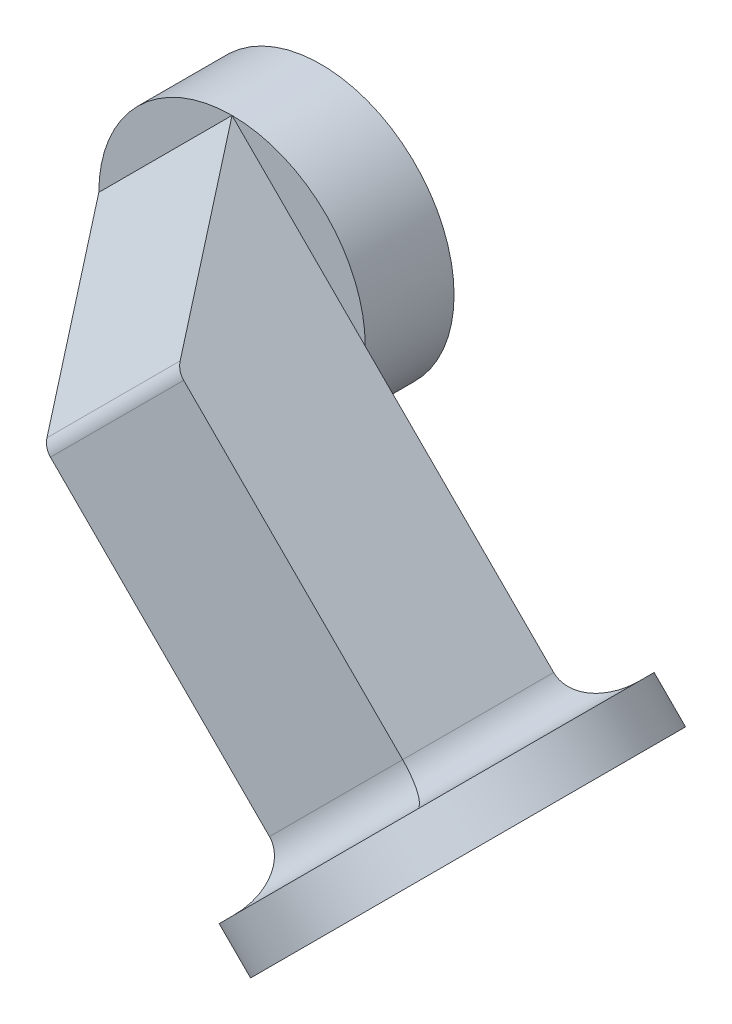
ISO-10303-21;
HEADER;
FILE_DESCRIPTION(('STEP AP214'),'2;1');
FILE_NAME('part.step','',(''),(''),'','','');
FILE_SCHEMA(('AUTOMOTIVE_DESIGN { 1 0 10303 214 1 1 1 1 }'));
ENDSEC;
DATA;
#1=APPLICATION_CONTEXT('core data for automotive mechanical design processes');
#2=APPLICATION_PROTOCOL_DEFINITION('international standard','automotive_design',2000,#1);
#3=PRODUCT_CONTEXT('',#1,'mechanical');
#4=PRODUCT('Part','Part','',(#3));
#5=PRODUCT_RELATED_PRODUCT_CATEGORY('part','',(#4));
#6=PRODUCT_DEFINITION_FORMATION('','',#4);
#7=PRODUCT_DEFINITION_CONTEXT('part definition',#1,'design');
#8=PRODUCT_DEFINITION('design','',#6,#7);
#9=PRODUCT_DEFINITION_SHAPE('','',#8);
#10=(LENGTH_UNIT() NAMED_UNIT(*) SI_UNIT(.MILLI.,.METRE.));
#11=(NAMED_UNIT(*) PLANE_ANGLE_UNIT() SI_UNIT($,.RADIAN.));
#12=(NAMED_UNIT(*) SI_UNIT($,.STERADIAN.) SOLID_ANGLE_UNIT());
#13=UNCERTAINTY_MEASURE_WITH_UNIT(LENGTH_MEASURE(1.E-05),#10,'distance_accuracy_value','');
#14=(GEOMETRIC_REPRESENTATION_CONTEXT(3) GLOBAL_UNCERTAINTY_ASSIGNED_CONTEXT((#13)) GLOBAL_UNIT_ASSIGNED_CONTEXT((#10,
#11,#12)) REPRESENTATION_CONTEXT('',''));
#15=CARTESIAN_POINT('',(0.,0.,0.));
#16=DIRECTION('',(0.,0.,1.));
#17=DIRECTION('',(1.,0.,0.));
#18=AXIS2_PLACEMENT_3D('',#15,#16,#17);
#19=CARTESIAN_POINT('',(23.3486659147798,-49.5828708116351,34.29));
#20=DIRECTION('',(0.,0.,-1.));
#21=DIRECTION('',(-1.,0.,0.));
#22=AXIS2_PLACEMENT_3D('',#19,#20,#21);
#23=CYLINDRICAL_SURFACE('',#22,5.08);
#24=CARTESIAN_POINT('',(23.3486659147798,-49.5828708116351,39.37));
#25=DIRECTION('',(0.5,0.5,0.707106781186547));
#26=DIRECTION('',(0.5,0.5,-0.707106781186547));
#27=AXIS2_PLACEMENT_3D('',#24,#25,#26);
#28=ELLIPSE('',#27,7.18420489685532,5.08);
#29=CARTESIAN_POINT('',(26.9407683632075,-45.9907683632075,34.29));
#30=VERTEX_POINT('',#29);
#31=CARTESIAN_POINT('',(26.9407683632075,-53.1749732600628,39.37));
#32=VERTEX_POINT('',#31);
#33=EDGE_CURVE('E11',#30,#32,#28,.F.);
#34=ORIENTED_EDGE('',*,*,#33,.F.);
#35=DIRECTION('',(0.,0.,1.));
#36=VECTOR('',#35,1.);
#37=CARTESIAN_POINT('',(26.9407683632075,-45.9907683632075,34.29));
#38=LINE('',#37,#36);
#39=CARTESIAN_POINT('',(26.9407683632075,-45.9907683632075,12.7));
#40=VERTEX_POINT('',#39);
#41=EDGE_CURVE('E180',#40,#30,#38,.T.);
#42=ORIENTED_EDGE('',*,*,#41,.F.);
#43=CARTESIAN_POINT('',(23.3486659147798,-49.5828708116351,7.62));
#44=DIRECTION('',(0.5,0.5,-0.707106781186547));
#45=DIRECTION('',(-0.5,-0.5,-0.707106781186547));
#46=AXIS2_PLACEMENT_3D('',#43,#44,#45);
#47=ELLIPSE('',#46,7.18420489685532,5.08);
#48=CARTESIAN_POINT('',(26.9407683632075,-53.1749732600628,7.62));
#49=VERTEX_POINT('',#48);
#50=EDGE_CURVE('E40',#40,#49,#47,.T.);
#51=ORIENTED_EDGE('',*,*,#50,.T.);
#52=DIRECTION('',(0.,0.,1.));
#53=VECTOR('',#52,1.);
#54=CARTESIAN_POINT('',(26.9407683632075,-53.1749732600628,34.29));
#55=LINE('',#54,#53);
#56=EDGE_CURVE('E163',#32,#49,#55,.F.);
#57=ORIENTED_EDGE('',*,*,#56,.F.);
#58=EDGE_LOOP('',(#34,#42,#51,#57));
#59=FACE_BOUND('',#58,.T.);
#60=ADVANCED_FACE('F33',(#59),#23,.F.);
#61=CARTESIAN_POINT('',(26.9407683632075,-45.9907683632075,7.62));
#62=DIRECTION('',(0.707106781186547,0.707106781186548,0.));
#63=DIRECTION('',(-0.707106781186548,0.707106781186547,0.));
#64=AXIS2_PLACEMENT_3D('',#61,#62,#63);
#65=CYLINDRICAL_SURFACE('',#64,5.08);
#66=ORIENTED_EDGE('',*,*,#50,.F.);
#67=DIRECTION('',(-0.707106781186547,-0.707106781186548,0.));
#68=VECTOR('',#67,1.);
#69=CARTESIAN_POINT('',(26.9407683632075,-45.9907683632075,12.7));
#70=LINE('',#69,#68);
#71=CARTESIAN_POINT('',(45.9907683632075,-26.9407683632075,12.7));
#72=VERTEX_POINT('',#71);
#73=EDGE_CURVE('E177',#72,#40,#70,.T.);
#74=ORIENTED_EDGE('',*,*,#73,.F.);
#75=CARTESIAN_POINT('',(49.5828708116351,-23.3486659147798,7.62));
#76=DIRECTION('',(0.5,0.5,0.707106781186547));
#77=DIRECTION('',(0.5,0.5,-0.707106781186547));
#78=AXIS2_PLACEMENT_3D('',#75,#76,#77);
#79=ELLIPSE('',#78,7.18420489685532,5.08);
#80=CARTESIAN_POINT('',(53.1749732600628,-26.9407683632075,7.62));
#81=VERTEX_POINT('',#80);
#82=EDGE_CURVE('E54',#72,#81,#79,.T.);
#83=ORIENTED_EDGE('',*,*,#82,.T.);
#84=DIRECTION('',(-0.707106781186547,-0.707106781186548,0.));
#85=VECTOR('',#84,1.);
#86=CARTESIAN_POINT('',(30.5328708116351,-49.5828708116351,7.62));
#87=LINE('',#86,#85);
#88=EDGE_CURVE('E166',#49,#81,#87,.F.);
#89=ORIENTED_EDGE('',*,*,#88,.F.);
#90=EDGE_LOOP('',(#66,#74,#83,#89));
#91=FACE_BOUND('',#90,.T.);
#92=ADVANCED_FACE('F187',(#91),#65,.F.);
#93=CARTESIAN_POINT('',(49.5828708116351,-23.3486659147798,34.29));
#94=DIRECTION('',(0.,0.,1.));
#95=DIRECTION('',(1.,0.,0.));
#96=AXIS2_PLACEMENT_3D('',#93,#94,#95);
#97=CYLINDRICAL_SURFACE('',#96,5.08);
#98=ORIENTED_EDGE('',*,*,#82,.F.);
#99=DIRECTION('',(0.,0.,-1.));
#100=VECTOR('',#99,1.);
#101=CARTESIAN_POINT('',(45.9907683632075,-26.9407683632075,34.29));
#102=LINE('',#101,#100);
#103=CARTESIAN_POINT('',(45.9907683632075,-26.9407683632075,34.29));
#104=VERTEX_POINT('',#103);
#105=EDGE_CURVE('E175',#104,#72,#102,.T.);
#106=ORIENTED_EDGE('',*,*,#105,.F.);
#107=CARTESIAN_POINT('',(49.5828708116351,-23.3486659147798,39.37));
#108=DIRECTION('',(-0.5,-0.5,0.707106781186547));
#109=DIRECTION('',(0.5,0.5,0.707106781186547));
#110=AXIS2_PLACEMENT_3D('',#107,#108,#109);
#111=ELLIPSE('',#110,7.18420489685532,5.08);
#112=CARTESIAN_POINT('',(53.1749732600628,-26.9407683632075,39.37));
#113=VERTEX_POINT('',#112);
#114=EDGE_CURVE('E183',#104,#113,#111,.T.);
#115=ORIENTED_EDGE('',*,*,#114,.T.);
#116=DIRECTION('',(0.,0.,-1.));
#117=VECTOR('',#116,1.);
#118=CARTESIAN_POINT('',(53.1749732600628,-26.9407683632075,34.29));
#119=LINE('',#118,#117);
#120=EDGE_CURVE('E169',#81,#113,#119,.F.);
#121=ORIENTED_EDGE('',*,*,#120,.F.);
#122=EDGE_LOOP('',(#98,#106,#115,#121));
#123=FACE_BOUND('',#122,.T.);
#124=ADVANCED_FACE('F249',(#123),#97,.F.);
#125=CARTESIAN_POINT('',(36.4657683632075,-36.4657683632075,39.37));
#126=DIRECTION('',(0.707106781186547,0.707106781186548,0.));
#127=DIRECTION('',(-0.707106781186548,0.707106781186547,0.));
#128=AXIS2_PLACEMENT_3D('',#125,#126,#127);
#129=CYLINDRICAL_SURFACE('',#128,5.08);
#130=DIRECTION('',(0.707106781186547,0.707106781186548,0.));
#131=VECTOR('',#130,1.);
#132=CARTESIAN_POINT('',(36.4657683632075,-36.4657683632075,34.29));
#133=LINE('',#132,#131);
#134=EDGE_CURVE('E160',#30,#104,#133,.T.);
#135=ORIENTED_EDGE('',*,*,#134,.F.);
#136=ORIENTED_EDGE('',*,*,#33,.T.);
#137=DIRECTION('',(0.707106781186547,0.707106781186548,0.));
#138=VECTOR('',#137,1.);
#139=CARTESIAN_POINT('',(40.0578708116351,-40.0578708116351,39.37));
#140=LINE('',#139,#138);
#141=EDGE_CURVE('E172',#113,#32,#140,.F.);
#142=ORIENTED_EDGE('',*,*,#141,.F.);
#143=ORIENTED_EDGE('',*,*,#114,.F.);
#144=EDGE_LOOP('',(#135,#136,#142,#143));
#145=FACE_BOUND('',#144,.T.);
#146=ADVANCED_FACE('F194',(#145),#129,.F.);
#147=CARTESIAN_POINT('',(-15.8604703137682,-26.155271309502,31.75));
#148=DIRECTION('',(-0.707106781186547,-0.707106781186548,0.));
#149=DIRECTION('',(0.707106781186548,-0.707106781186547,0.));
#150=AXIS2_PLACEMENT_3D('',#147,#148,#149);
#151=CYLINDRICAL_SURFACE('',#150,2.54);
#152=DIRECTION('',(0.707106781186547,0.707106781186548,0.));
#153=VECTOR('',#152,1.);
#154=CARTESIAN_POINT('',(-17.1894719589103,-24.82626966436,33.4585400944723));
#155=LINE('',#154,#153);
#156=CARTESIAN_POINT('',(-5.70660114727514,-13.3433988527249,33.4585400944723));
#157=VERTEX_POINT('',#156);
#158=CARTESIAN_POINT('',(13.3433988527249,5.70660114727514,33.4585400944723));
#159=VERTEX_POINT('',#158);
#160=EDGE_CURVE('E104',#157,#159,#155,.T.);
#161=ORIENTED_EDGE('',*,*,#160,.F.);
#162=CARTESIAN_POINT('',(-4.37759950213307,-14.6724004978669,31.75));
#163=DIRECTION('',(0.707106781186548,0.707106781186548,0.));
#164=DIRECTION('',(-0.707106781186548,0.707106781186548,0.));
#165=AXIS2_PLACEMENT_3D('',#162,#163,#164);
#166=CIRCLE('',#165,2.54);
#167=CARTESIAN_POINT('',(-4.37759950213307,-14.6724004978669,34.29));
#168=VERTEX_POINT('',#167);
#169=EDGE_CURVE('E156',#168,#157,#166,.F.);
#170=ORIENTED_EDGE('',*,*,#169,.F.);
#171=DIRECTION('',(0.707106781186547,0.707106781186548,0.));
#172=VECTOR('',#171,1.);
#173=CARTESIAN_POINT('',(-15.8604703137682,-26.155271309502,34.29));
#174=LINE('',#173,#172);
#175=CARTESIAN_POINT('',(14.6724004978669,4.37759950213308,34.29));
#176=VERTEX_POINT('',#175);
#177=EDGE_CURVE('E153',#176,#168,#174,.F.);
#178=ORIENTED_EDGE('',*,*,#177,.F.);
#179=CARTESIAN_POINT('',(14.6724004978669,4.37759950213308,31.75));
#180=DIRECTION('',(-0.707106781186547,-0.707106781186548,0.));
#181=DIRECTION('',(0.707106781186548,-0.707106781186547,0.));
#182=AXIS2_PLACEMENT_3D('',#179,#180,#181);
#183=CIRCLE('',#182,2.54);
#184=EDGE_CURVE('E158',#159,#176,#183,.F.);
#185=ORIENTED_EDGE('',*,*,#184,.F.);
#186=EDGE_LOOP('',(#161,#170,#178,#185));
#187=FACE_BOUND('',#186,.T.);
#188=ADVANCED_FACE('F208',(#187),#151,.T.);
#189=CARTESIAN_POINT('',(0.,0.,12.7));
#190=DIRECTION('',(0.,0.,1.));
#191=DIRECTION('',(1.,0.,0.));
#192=AXIS2_PLACEMENT_3D('',#189,#190,#191);
#193=PLANE('',#192);
#194=DIRECTION('',(-0.707106781186547,-0.707106781186547,0.));
#195=VECTOR('',#194,1.);
#196=CARTESIAN_POINT('',(0.,19.05,12.7));
#197=LINE('',#196,#195);
#198=CARTESIAN_POINT('',(0.,19.05,12.7));
#199=VERTEX_POINT('',#198);
#200=CARTESIAN_POINT('',(-19.05,0.,12.7));
#201=VERTEX_POINT('',#200);
#202=EDGE_CURVE('E101',#199,#201,#197,.T.);
#203=ORIENTED_EDGE('',*,*,#202,.F.);
#204=CARTESIAN_POINT('',(0.,0.,12.7));
#205=DIRECTION('',(0.,0.,1.));
#206=DIRECTION('',(1.,0.,0.));
#207=AXIS2_PLACEMENT_3D('',#204,#205,#206);
#208=CIRCLE('',#207,19.05);
#209=EDGE_CURVE('E115',#199,#201,#208,.T.);
#210=ORIENTED_EDGE('',*,*,#209,.T.);
#211=EDGE_LOOP('',(#203,#210));
#212=FACE_BOUND('',#211,.T.);
#213=ADVANCED_FACE('F114',(#212),#193,.T.);
#214=DIRECTION('',(-0.707106781186548,0.707106781186548,0.));
#215=VECTOR('',#214,1.);
#216=CARTESIAN_POINT('',(19.05,0.,12.7));
#217=LINE('',#216,#215);
#218=CARTESIAN_POINT('',(19.05,0.,12.7));
#219=VERTEX_POINT('',#218);
#220=EDGE_CURVE('E133',#219,#199,#217,.T.);
#221=ORIENTED_EDGE('',*,*,#220,.F.);
#222=EDGE_CURVE('E126',#219,#199,#208,.T.);
#223=ORIENTED_EDGE('',*,*,#222,.T.);
#224=EDGE_LOOP('',(#221,#223));
#225=FACE_BOUND('',#224,.T.);
#226=ADVANCED_FACE('F132',(#225),#193,.T.);
#227=CARTESIAN_POINT('',(0.,0.,12.7));
#228=DIRECTION('',(0.,0.,-1.));
#229=DIRECTION('',(-1.,0.,0.));
#230=AXIS2_PLACEMENT_3D('',#227,#228,#229);
#231=CYLINDRICAL_SURFACE('',#230,19.05);
#232=ORIENTED_EDGE('',*,*,#222,.F.);
#233=CARTESIAN_POINT('',(0.,-19.05,12.7));
#234=VERTEX_POINT('',#233);
#235=EDGE_CURVE('E134',#234,#219,#208,.T.);
#236=ORIENTED_EDGE('',*,*,#235,.F.);
#237=EDGE_CURVE('E128',#201,#234,#208,.T.);
#238=ORIENTED_EDGE('',*,*,#237,.F.);
#239=ORIENTED_EDGE('',*,*,#209,.F.);
#240=EDGE_LOOP('',(#232,#236,#238,#239));
#241=FACE_BOUND('',#240,.T.);
#242=CARTESIAN_POINT('',(0.,0.,0.));
#243=DIRECTION('',(0.,0.,1.));
#244=DIRECTION('',(1.,0.,0.));
#245=AXIS2_PLACEMENT_3D('',#242,#243,#244);
#246=CIRCLE('',#245,19.05);
#247=CARTESIAN_POINT('',(19.05,0.,0.));
#248=VERTEX_POINT('',#247);
#249=EDGE_CURVE('E149',#248,#248,#246,.T.);
#250=ORIENTED_EDGE('',*,*,#249,.T.);
#251=EDGE_LOOP('',(#250));
#252=FACE_BOUND('',#251,.T.);
#253=ADVANCED_FACE('F123',(#241,#252),#231,.T.);
#254=DIRECTION('',(0.707106781186548,-0.707106781186548,0.));
#255=VECTOR('',#254,1.);
#256=CARTESIAN_POINT('',(-19.05,0.,12.7));
#257=LINE('',#256,#255);
#258=EDGE_CURVE('E116',#201,#234,#257,.T.);
#259=ORIENTED_EDGE('',*,*,#258,.F.);
#260=ORIENTED_EDGE('',*,*,#237,.T.);
#261=EDGE_LOOP('',(#259,#260));
#262=FACE_BOUND('',#261,.T.);
#263=ADVANCED_FACE('F233',(#262),#193,.T.);
#264=CARTESIAN_POINT('',(0.,0.,0.));
#265=DIRECTION('',(0.,0.,1.));
#266=DIRECTION('',(1.,0.,0.));
#267=AXIS2_PLACEMENT_3D('',#264,#265,#266);
#268=PLANE('',#267);
#269=CARTESIAN_POINT('',(0.,0.,0.));
#270=DIRECTION('',(0.,0.,-1.));
#271=DIRECTION('',(-1.,0.,0.));
#272=AXIS2_PLACEMENT_3D('',#269,#270,#271);
#273=CIRCLE('',#272,4.064);
#274=CARTESIAN_POINT('',(-4.064,0.,0.));
#275=VERTEX_POINT('',#274);
#276=EDGE_CURVE('E216',#275,#275,#273,.T.);
#277=ORIENTED_EDGE('',*,*,#276,.F.);
#278=EDGE_LOOP('',(#277));
#279=FACE_BOUND('',#278,.T.);
#280=ORIENTED_EDGE('',*,*,#249,.F.);
#281=EDGE_LOOP('',(#280));
#282=FACE_BOUND('',#281,.T.);
#283=ADVANCED_FACE('F230',(#279,#282),#268,.F.);
#284=CARTESIAN_POINT('',(-19.05,0.,34.29));
#285=DIRECTION('',(0.707106781186548,0.707106781186548,0.));
#286=DIRECTION('',(-0.707106781186548,0.707106781186548,0.));
#287=AXIS2_PLACEMENT_3D('',#284,#285,#286);
#288=PLANE('',#287);
#289=DIRECTION('',(-0.707106781186548,0.707106781186547,0.));
#290=VECTOR('',#289,1.);
#291=CARTESIAN_POINT('',(30.5328708116351,-49.5828708116351,12.7));
#292=LINE('',#291,#290);
#293=EDGE_CURVE('E117',#40,#234,#292,.T.);
#294=ORIENTED_EDGE('',*,*,#293,.F.);
#295=ORIENTED_EDGE('',*,*,#41,.T.);
#296=DIRECTION('',(0.707106781186548,-0.707106781186548,0.));
#297=VECTOR('',#296,1.);
#298=CARTESIAN_POINT('',(-19.05,0.,34.29));
#299=LINE('',#298,#297);
#300=EDGE_CURVE('E141',#168,#30,#299,.T.);
#301=ORIENTED_EDGE('',*,*,#300,.F.);
#302=ORIENTED_EDGE('',*,*,#169,.T.);
#303=DIRECTION('',(-0.475637908161596,0.475637908161596,-0.739957539754358));
#304=VECTOR('',#303,1.);
#305=CARTESIAN_POINT('',(-11.4513594216806,-7.59864057831937,24.521327298203));
#306=LINE('',#305,#304);
#307=EDGE_CURVE('E108',#157,#201,#306,.T.);
#308=ORIENTED_EDGE('',*,*,#307,.T.);
#309=ORIENTED_EDGE('',*,*,#258,.T.);
#310=EDGE_LOOP('',(#294,#295,#301,#302,#308,#309));
#311=FACE_BOUND('',#310,.T.);
#312=ADVANCED_FACE('F198',(#311),#288,.F.);
#313=CARTESIAN_POINT('',(19.05,0.,34.29));
#314=DIRECTION('',(-0.707106781186547,-0.707106781186548,0.));
#315=DIRECTION('',(0.707106781186548,-0.707106781186547,0.));
#316=AXIS2_PLACEMENT_3D('',#313,#314,#315);
#317=PLANE('',#316);
#318=DIRECTION('',(-0.707106781186548,0.707106781186548,0.));
#319=VECTOR('',#318,1.);
#320=CARTESIAN_POINT('',(19.05,0.,34.29));
#321=LINE('',#320,#319);
#322=EDGE_CURVE('E144',#104,#176,#321,.T.);
#323=ORIENTED_EDGE('',*,*,#322,.F.);
#324=ORIENTED_EDGE('',*,*,#105,.T.);
#325=DIRECTION('',(-0.707106781186548,0.707106781186547,0.));
#326=VECTOR('',#325,1.);
#327=CARTESIAN_POINT('',(49.5828708116351,-30.5328708116351,12.7));
#328=LINE('',#327,#326);
#329=EDGE_CURVE('E139',#72,#219,#328,.T.);
#330=ORIENTED_EDGE('',*,*,#329,.T.);
#331=ORIENTED_EDGE('',*,*,#220,.T.);
#332=DIRECTION('',(-0.475637908161596,0.475637908161596,-0.739957539754358));
#333=VECTOR('',#332,1.);
#334=CARTESIAN_POINT('',(13.8778536409236,5.17214635907645,34.29));
#335=LINE('',#334,#333);
#336=EDGE_CURVE('E97',#159,#199,#335,.T.);
#337=ORIENTED_EDGE('',*,*,#336,.F.);
#338=ORIENTED_EDGE('',*,*,#184,.T.);
#339=EDGE_LOOP('',(#323,#324,#330,#331,#337,#338));
#340=FACE_BOUND('',#339,.T.);
#341=ADVANCED_FACE('F136',(#340),#317,.F.);
#342=CARTESIAN_POINT('',(0.,0.,34.29));
#343=DIRECTION('',(0.,0.,1.));
#344=DIRECTION('',(1.,0.,0.));
#345=AXIS2_PLACEMENT_3D('',#342,#343,#344);
#346=PLANE('',#345);
#347=ORIENTED_EDGE('',*,*,#300,.T.);
#348=ORIENTED_EDGE('',*,*,#134,.T.);
#349=ORIENTED_EDGE('',*,*,#322,.T.);
#350=ORIENTED_EDGE('',*,*,#177,.T.);
#351=EDGE_LOOP('',(#347,#348,#349,#350));
#352=FACE_BOUND('',#351,.T.);
#353=ADVANCED_FACE('F205',(#352),#346,.T.);
#354=CARTESIAN_POINT('',(30.5328708116351,-49.5828708116351,12.7));
#355=DIRECTION('',(0.,0.,1.));
#356=DIRECTION('',(1.,0.,0.));
#357=AXIS2_PLACEMENT_3D('',#354,#355,#356);
#358=PLANE('',#357);
#359=ORIENTED_EDGE('',*,*,#329,.F.);
#360=ORIENTED_EDGE('',*,*,#73,.T.);
#361=ORIENTED_EDGE('',*,*,#293,.T.);
#362=ORIENTED_EDGE('',*,*,#235,.T.);
#363=EDGE_LOOP('',(#359,#360,#361,#362));
#364=FACE_BOUND('',#363,.T.);
#365=ADVANCED_FACE('F269',(#364),#358,.F.);
#366=CARTESIAN_POINT('',(-16.6550171707116,-25.3607244525587,34.29));
#367=DIRECTION('',(0.523228994150421,-0.523228994150421,-0.672653580500898));
#368=DIRECTION('',(-0.78932151559364,0.,-0.61398008519899));
#369=AXIS2_PLACEMENT_3D('',#366,#367,#368);
#370=PLANE('',#369);
#371=ORIENTED_EDGE('',*,*,#307,.F.);
#372=ORIENTED_EDGE('',*,*,#160,.T.);
#373=ORIENTED_EDGE('',*,*,#336,.T.);
#374=ORIENTED_EDGE('',*,*,#202,.T.);
#375=EDGE_LOOP('',(#371,#372,#373,#374));
#376=FACE_BOUND('',#375,.T.);
#377=ADVANCED_FACE('F100',(#376),#370,.F.);
#378=CARTESIAN_POINT('',(44.5479988721697,-44.5479988721697,23.495));
#379=DIRECTION('',(-0.707106781186548,0.707106781186547,0.));
#380=DIRECTION('',(-0.707106781186547,-0.707106781186548,0.));
#381=AXIS2_PLACEMENT_3D('',#378,#379,#380);
#382=CYLINDRICAL_SURFACE('',#381,25.4);
#383=CARTESIAN_POINT('',(44.5479988721697,-44.5479988721697,23.495));
#384=DIRECTION('',(0.707106781186548,-0.707106781186547,0.));
#385=DIRECTION('',(0.707106781186547,0.707106781186548,0.));
#386=AXIS2_PLACEMENT_3D('',#383,#384,#385);
#387=CIRCLE('',#386,25.4);
#388=CARTESIAN_POINT('',(26.5874866300314,-62.508511114308,23.495));
#389=VERTEX_POINT('',#388);
#390=EDGE_CURVE('E109',#389,#389,#387,.T.);
#391=CARTESIAN_POINT('',(40.0578708116351,-40.0578708116351,23.495));
#392=DIRECTION('',(0.707106781186548,-0.707106781186547,0.));
#393=DIRECTION('',(0.707106781186547,0.707106781186548,0.));
#394=AXIS2_PLACEMENT_3D('',#391,#392,#393);
#395=CIRCLE('',#394,25.4);
#396=CARTESIAN_POINT('',(22.0973585694968,-58.0183830537734,23.495));
#397=VERTEX_POINT('',#396);
#398=EDGE_CURVE('E210',#397,#397,#395,.T.);
#399=CARTESIAN_POINT('',(26.5874866300314,-62.508511114308,23.495));
#400=CARTESIAN_POINT('',(26.5407144627342,-62.4617389470108,23.495));
#401=CARTESIAN_POINT('',(26.4939422954369,-62.4149667797135,23.495));
#402=CARTESIAN_POINT('',(26.4003979608425,-62.3214224451191,23.495));
#403=CARTESIAN_POINT('',(26.3536257935452,-62.2746502778218,23.495));
#404=CARTESIAN_POINT('',(26.2600814589508,-62.1811059432274,23.495));
#405=CARTESIAN_POINT('',(26.2133092916535,-62.1343337759301,23.495));
#406=CARTESIAN_POINT('',(26.1197649570591,-62.0407894413357,23.495));
#407=CARTESIAN_POINT('',(26.0729927897618,-61.9940172740384,23.495));
#408=CARTESIAN_POINT('',(25.9794484551674,-61.9004729394439,23.495));
#409=CARTESIAN_POINT('',(25.9326762878701,-61.8537007721467,23.495));
#410=CARTESIAN_POINT('',(25.8391319532756,-61.7601564375522,23.495));
#411=CARTESIAN_POINT('',(25.7923597859784,-61.713384270255,23.495));
#412=CARTESIAN_POINT('',(25.6988154513839,-61.6198399356605,23.495));
#413=CARTESIAN_POINT('',(25.6520432840867,-61.5730677683633,23.495));
#414=CARTESIAN_POINT('',(25.5584989494922,-61.4795234337688,23.495));
#415=CARTESIAN_POINT('',(25.511726782195,-61.4327512664716,23.495));
#416=CARTESIAN_POINT('',(25.4181824476005,-61.3392069318771,23.495));
#417=CARTESIAN_POINT('',(25.3714102803033,-61.2924347645799,23.495));
#418=CARTESIAN_POINT('',(25.2778659457088,-61.1988904299854,23.495));
#419=CARTESIAN_POINT('',(25.2310937784116,-61.1521182626882,23.495));
#420=CARTESIAN_POINT('',(25.1375494438171,-61.0585739280937,23.495));
#421=CARTESIAN_POINT('',(25.0907772765199,-61.0118017607965,23.495));
#422=CARTESIAN_POINT('',(24.9972329419254,-60.918257426202,23.495));
#423=CARTESIAN_POINT('',(24.9504607746282,-60.8714852589048,23.495));
#424=CARTESIAN_POINT('',(24.8569164400337,-60.7779409243103,23.495));
#425=CARTESIAN_POINT('',(24.8101442727365,-60.7311687570131,23.495));
#426=CARTESIAN_POINT('',(24.716599938142,-60.6376244224186,23.495));
#427=CARTESIAN_POINT('',(24.6698277708448,-60.5908522551214,23.495));
#428=CARTESIAN_POINT('',(24.5762834362503,-60.4973079205269,23.495));
#429=CARTESIAN_POINT('',(24.5295112689531,-60.4505357532297,23.495));
#430=CARTESIAN_POINT('',(24.4359669343586,-60.3569914186352,23.495));
#431=CARTESIAN_POINT('',(24.3891947670614,-60.3102192513379,23.495));
#432=CARTESIAN_POINT('',(24.2956504324669,-60.2166749167435,23.495));
#433=CARTESIAN_POINT('',(24.2488782651697,-60.1699027494462,23.495));
#434=CARTESIAN_POINT('',(24.1553339305752,-60.0763584148518,23.495));
#435=CARTESIAN_POINT('',(24.1085617632779,-60.0295862475545,23.495));
#436=CARTESIAN_POINT('',(24.0150174286835,-59.9360419129601,23.495));
#437=CARTESIAN_POINT('',(23.9682452613862,-59.8892697456628,23.495));
#438=CARTESIAN_POINT('',(23.8747009267918,-59.7957254110684,23.495));
#439=CARTESIAN_POINT('',(23.8279287594945,-59.7489532437711,23.495));
#440=CARTESIAN_POINT('',(23.7343844249001,-59.6554089091767,23.495));
#441=CARTESIAN_POINT('',(23.6876122576028,-59.6086367418794,23.495));
#442=CARTESIAN_POINT('',(23.5940679230084,-59.515092407285,23.495));
#443=CARTESIAN_POINT('',(23.5472957557111,-59.4683202399877,23.495));
#444=CARTESIAN_POINT('',(23.4537514211167,-59.3747759053932,23.495));
#445=CARTESIAN_POINT('',(23.4069792538194,-59.328003738096,23.495));
#446=CARTESIAN_POINT('',(23.3134349192249,-59.2344594035015,23.495));
#447=CARTESIAN_POINT('',(23.2666627519277,-59.1876872362043,23.495));
#448=CARTESIAN_POINT('',(23.1731184173332,-59.0941429016098,23.495));
#449=CARTESIAN_POINT('',(23.126346250036,-59.0473707343126,23.495));
#450=CARTESIAN_POINT('',(23.0328019154415,-58.9538263997181,23.495));
#451=CARTESIAN_POINT('',(22.9860297481443,-58.9070542324209,23.495));
#452=CARTESIAN_POINT('',(22.8924854135498,-58.8135098978264,23.495));
#453=CARTESIAN_POINT('',(22.8457132462526,-58.7667377305292,23.495));
#454=CARTESIAN_POINT('',(22.7521689116581,-58.6731933959347,23.495));
#455=CARTESIAN_POINT('',(22.7053967443609,-58.6264212286375,23.495));
#456=CARTESIAN_POINT('',(22.6118524097664,-58.532876894043,23.495));
#457=CARTESIAN_POINT('',(22.5650802424692,-58.4861047267458,23.495));
#458=CARTESIAN_POINT('',(22.4715359078747,-58.3925603921513,23.495));
#459=CARTESIAN_POINT('',(22.4247637405775,-58.3457882248541,23.495));
#460=CARTESIAN_POINT('',(22.331219405983,-58.2522438902596,23.495));
#461=CARTESIAN_POINT('',(22.2844472386858,-58.2054717229624,23.495));
#462=CARTESIAN_POINT('',(22.1909029040913,-58.1119273883679,23.495));
#463=CARTESIAN_POINT('',(22.1441307367941,-58.0651552210707,23.495));
#464=CARTESIAN_POINT('',(22.0973585694968,-58.0183830537734,23.495));
#465=B_SPLINE_CURVE_WITH_KNOTS('',3,(#399,#400,#401,#402,#403,#404,#405,#406,#407,#408,#409,
#410,#411,#412,#413,#414,#415,#416,#417,#418,#419,#420,#421,#422,#423,#424,#425,#426,#427,#428,
#429,#430,#431,#432,#433,#434,#435,#436,#437,#438,#439,#440,#441,#442,#443,#444,#445,#446,#447,
#448,#449,#450,#451,#452,#453,#454,#455,#456,#457,#458,#459,#460,#461,#462,#463,#464),
.UNSPECIFIED.,.F.,.F.,(4,2,2,2,2,2,2,2,2,2,2,2,2,2,2,2,2,2,2,2,2,2,2,2,2,2,2,2,2,2,2,2,4),(0.,
0.198437499999994,0.396874999999996,0.595312499999995,0.793749999999994,0.992187499999996,
1.190625,1.38906249999999,1.5875,1.7859375,1.98437499999999,2.18281249999999,2.38125,
2.57968749999999,2.77812499999999,2.9765625,3.17499999999999,3.37343749999999,3.571875,
3.77031249999999,3.96874999999999,4.1671875,4.36562499999999,4.56406249999999,4.7625,
4.96093749999999,5.15937499999999,5.35781249999999,5.55624999999999,5.75468749999999,
5.95312499999999,6.15156249999999,6.34999999999999),.UNSPECIFIED.);
#466=EDGE_CURVE('BSEAM274',#389,#397,#465,.T.);
#467=ORIENTED_EDGE('',*,*,#390,.F.);
#468=ORIENTED_EDGE('',*,*,#398,.T.);
#469=ORIENTED_EDGE('',*,*,#466,.T.);
#470=ORIENTED_EDGE('',*,*,#466,.F.);
#471=EDGE_LOOP('',(#467,#469,#468,#470));
#472=FACE_BOUND('',#471,.T.);
#473=ADVANCED_FACE('F274',(#472),#382,.T.);
#474=CARTESIAN_POINT('',(44.5479988721697,-44.5479988721697,23.495));
#475=DIRECTION('',(0.707106781186548,-0.707106781186547,0.));
#476=DIRECTION('',(0.707106781186547,0.707106781186548,0.));
#477=AXIS2_PLACEMENT_3D('',#474,#475,#476);
#478=PLANE('',#477);
#479=ORIENTED_EDGE('',*,*,#390,.T.);
#480=EDGE_LOOP('',(#479));
#481=FACE_BOUND('',#480,.T.);
#482=ADVANCED_FACE('F277',(#481),#478,.T.);
#483=CARTESIAN_POINT('',(40.0578708116351,-40.0578708116351,23.495));
#484=DIRECTION('',(0.707106781186548,-0.707106781186547,0.));
#485=DIRECTION('',(0.707106781186547,0.707106781186548,0.));
#486=AXIS2_PLACEMENT_3D('',#483,#484,#485);
#487=PLANE('',#486);
#488=ORIENTED_EDGE('',*,*,#120,.T.);
#489=ORIENTED_EDGE('',*,*,#141,.T.);
#490=ORIENTED_EDGE('',*,*,#56,.T.);
#491=ORIENTED_EDGE('',*,*,#88,.T.);
#492=EDGE_LOOP('',(#488,#489,#490,#491));
#493=FACE_BOUND('',#492,.T.);
#494=ORIENTED_EDGE('',*,*,#398,.F.);
#495=EDGE_LOOP('',(#494));
#496=FACE_BOUND('',#495,.T.);
#497=ADVANCED_FACE('F189',(#493,#496),#487,.F.);
#498=CARTESIAN_POINT('',(0.,0.,2.032));
#499=DIRECTION('',(0.,0.,-1.));
#500=DIRECTION('',(-1.,0.,0.));
#501=AXIS2_PLACEMENT_3D('',#498,#499,#500);
#502=CYLINDRICAL_SURFACE('',#501,4.064);
#503=CARTESIAN_POINT('',(0.,0.,2.032));
#504=DIRECTION('',(0.,0.,-1.));
#505=DIRECTION('',(-1.,0.,0.));
#506=AXIS2_PLACEMENT_3D('',#503,#504,#505);
#507=CIRCLE('',#506,4.064);
#508=CARTESIAN_POINT('',(-4.064,0.,2.032));
#509=VERTEX_POINT('',#508);
#510=EDGE_CURVE('E213',#509,#509,#507,.T.);
#511=ORIENTED_EDGE('',*,*,#510,.F.);
#512=EDGE_LOOP('',(#511));
#513=FACE_BOUND('',#512,.T.);
#514=ORIENTED_EDGE('',*,*,#276,.T.);
#515=EDGE_LOOP('',(#514));
#516=FACE_BOUND('',#515,.T.);
#517=ADVANCED_FACE('F224',(#513,#516),#502,.F.);
#518=CARTESIAN_POINT('',(0.,0.,2.032));
#519=DIRECTION('',(0.,0.,-1.));
#520=DIRECTION('',(-1.,0.,0.));
#521=AXIS2_PLACEMENT_3D('',#518,#519,#520);
#522=PLANE('',#521);
#523=ORIENTED_EDGE('',*,*,#510,.T.);
#524=EDGE_LOOP('',(#523));
#525=FACE_BOUND('',#524,.T.);
#526=ADVANCED_FACE('F222',(#525),#522,.T.);
#527=CLOSED_SHELL('',(#60,#92,#124,#146,#188,#213,#226,#253,#263,#283,#312,#341,#353,#365,#377,
#473,#482,#497,#517,#526));
#528=MANIFOLD_SOLID_BREP('B2',#527);
#529=ADVANCED_BREP_SHAPE_REPRESENTATION('',(#18,#528),#14);
#530=SHAPE_DEFINITION_REPRESENTATION(#9,#529);
ENDSEC;
END-ISO-10303-21;
